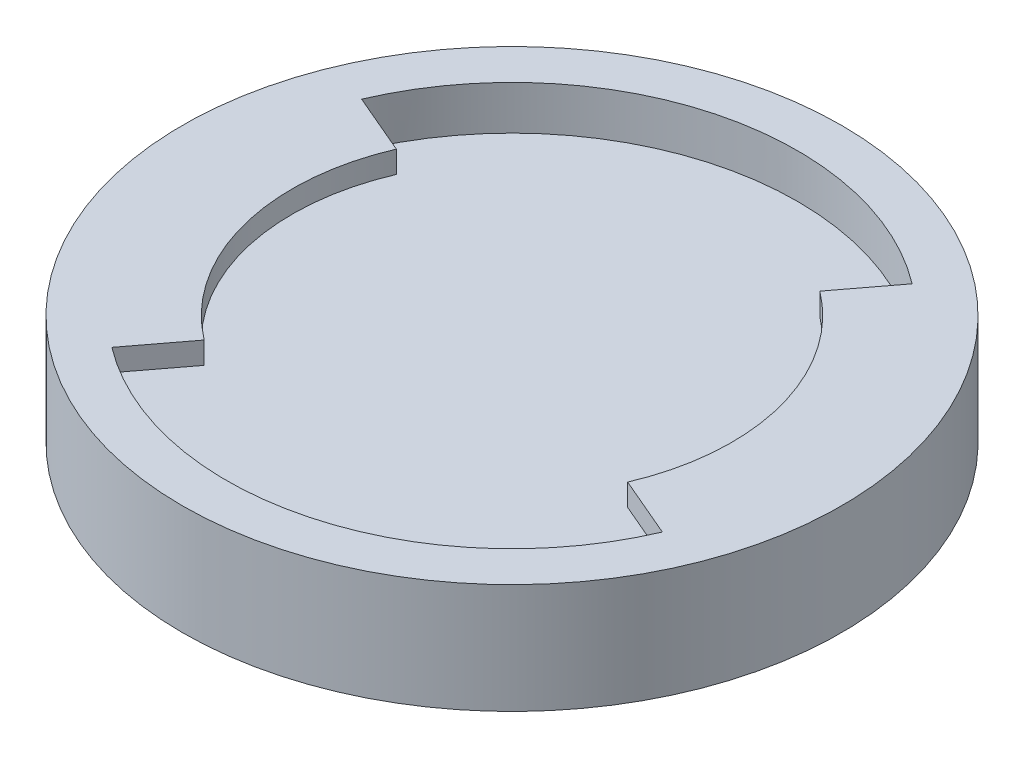
ISO-10303-21;
HEADER;
FILE_DESCRIPTION(('STEP AP214'),'2;1');
FILE_NAME('part.step','',(''),(''),'','','');
FILE_SCHEMA(('AUTOMOTIVE_DESIGN { 1 0 10303 214 1 1 1 1 }'));
ENDSEC;
DATA;
#1=APPLICATION_CONTEXT('core data for automotive mechanical design processes');
#2=APPLICATION_PROTOCOL_DEFINITION('international standard','automotive_design',2000,#1);
#3=PRODUCT_CONTEXT('',#1,'mechanical');
#4=PRODUCT('Part','Part','',(#3));
#5=PRODUCT_RELATED_PRODUCT_CATEGORY('part','',(#4));
#6=PRODUCT_DEFINITION_FORMATION('','',#4);
#7=PRODUCT_DEFINITION_CONTEXT('part definition',#1,'design');
#8=PRODUCT_DEFINITION('design','',#6,#7);
#9=PRODUCT_DEFINITION_SHAPE('','',#8);
#10=(LENGTH_UNIT() NAMED_UNIT(*) SI_UNIT(.MILLI.,.METRE.));
#11=(NAMED_UNIT(*) PLANE_ANGLE_UNIT() SI_UNIT($,.RADIAN.));
#12=(NAMED_UNIT(*) SI_UNIT($,.STERADIAN.) SOLID_ANGLE_UNIT());
#13=UNCERTAINTY_MEASURE_WITH_UNIT(LENGTH_MEASURE(1.E-05),#10,'distance_accuracy_value','');
#14=(GEOMETRIC_REPRESENTATION_CONTEXT(3) GLOBAL_UNCERTAINTY_ASSIGNED_CONTEXT((#13)) GLOBAL_UNIT_ASSIGNED_CONTEXT((#10,
#11,#12)) REPRESENTATION_CONTEXT('',''));
#15=CARTESIAN_POINT('',(0.,0.,0.));
#16=DIRECTION('',(0.,0.,1.));
#17=DIRECTION('',(1.,0.,0.));
#18=AXIS2_PLACEMENT_3D('',#15,#16,#17);
#19=CARTESIAN_POINT('',(0.,-3.,0.));
#20=DIRECTION('',(0.,1.,0.));
#21=DIRECTION('',(0.,0.,1.));
#22=AXIS2_PLACEMENT_3D('',#19,#20,#21);
#23=CYLINDRICAL_SURFACE('',#22,15.);
#24=CARTESIAN_POINT('',(0.,-3.,0.));
#25=DIRECTION('',(0.,1.,0.));
#26=DIRECTION('',(0.,0.,1.));
#27=AXIS2_PLACEMENT_3D('',#24,#25,#26);
#28=CIRCLE('',#27,15.);
#29=CARTESIAN_POINT('',(0.,-3.,15.));
#30=VERTEX_POINT('',#29);
#31=EDGE_CURVE('E40',#30,#30,#28,.T.);
#32=ORIENTED_EDGE('',*,*,#31,.T.);
#33=EDGE_LOOP('',(#32));
#34=FACE_BOUND('',#33,.T.);
#35=CARTESIAN_POINT('',(0.,2.,0.));
#36=DIRECTION('',(0.,1.,0.));
#37=DIRECTION('',(0.,0.,1.));
#38=AXIS2_PLACEMENT_3D('',#35,#36,#37);
#39=CIRCLE('',#38,15.);
#40=CARTESIAN_POINT('',(0.,2.,15.));
#41=VERTEX_POINT('',#40);
#42=EDGE_CURVE('E164',#41,#41,#39,.T.);
#43=ORIENTED_EDGE('',*,*,#42,.F.);
#44=EDGE_LOOP('',(#43));
#45=FACE_BOUND('',#44,.T.);
#46=ADVANCED_FACE('F33',(#34,#45),#23,.T.);
#47=CARTESIAN_POINT('',(0.,-3.,0.));
#48=DIRECTION('',(0.,1.,0.));
#49=DIRECTION('',(0.,0.,1.));
#50=AXIS2_PLACEMENT_3D('',#47,#48,#49);
#51=PLANE('',#50);
#52=ORIENTED_EDGE('',*,*,#31,.F.);
#53=EDGE_LOOP('',(#52));
#54=FACE_BOUND('',#53,.T.);
#55=ADVANCED_FACE('F171',(#54),#51,.F.);
#56=CARTESIAN_POINT('',(0.,2.,0.));
#57=DIRECTION('',(0.,1.,0.));
#58=DIRECTION('',(0.,0.,1.));
#59=AXIS2_PLACEMENT_3D('',#56,#57,#58);
#60=PLANE('',#59);
#61=ORIENTED_EDGE('',*,*,#42,.T.);
#62=EDGE_LOOP('',(#61));
#63=FACE_BOUND('',#62,.T.);
#64=CARTESIAN_POINT('',(0.,2.,0.));
#65=DIRECTION('',(0.,1.,0.));
#66=DIRECTION('',(0.,0.,1.));
#67=AXIS2_PLACEMENT_3D('',#64,#65,#66);
#68=CIRCLE('',#67,13.);
#69=CARTESIAN_POINT('',(7.85470191164406,2.,-10.3587478914787));
#70=VERTEX_POINT('',#69);
#71=CARTESIAN_POINT('',(-11.9536705087102,2.,-5.10977116602993));
#72=VERTEX_POINT('',#71);
#73=EDGE_CURVE('E162',#70,#72,#68,.T.);
#74=ORIENTED_EDGE('',*,*,#73,.F.);
#75=DIRECTION('',(-0.604207839357236,0.,0.796826760882979));
#76=VECTOR('',#75,1.);
#77=CARTESIAN_POINT('',(6.04207839357236,2.,-7.9682676088298));
#78=LINE('',#77,#76);
#79=CARTESIAN_POINT('',(6.04207839357236,2.,-7.9682676088298));
#80=VERTEX_POINT('',#79);
#81=EDGE_CURVE('E129',#70,#80,#78,.T.);
#82=ORIENTED_EDGE('',*,*,#81,.T.);
#83=CARTESIAN_POINT('',(0.,2.,0.));
#84=DIRECTION('',(0.,-1.,0.));
#85=DIRECTION('',(0.,0.,-1.));
#86=AXIS2_PLACEMENT_3D('',#83,#84,#85);
#87=CIRCLE('',#86,10.);
#88=CARTESIAN_POINT('',(9.19513116054635,2.,3.93059320463841));
#89=VERTEX_POINT('',#88);
#90=EDGE_CURVE('E147',#80,#89,#87,.T.);
#91=ORIENTED_EDGE('',*,*,#90,.T.);
#92=DIRECTION('',(0.919513116054634,0.,0.393059320463841));
#93=VECTOR('',#92,1.);
#94=CARTESIAN_POINT('',(9.19513116054635,2.,3.93059320463841));
#95=LINE('',#94,#93);
#96=CARTESIAN_POINT('',(11.9536705087102,2.,5.10977116602993));
#97=VERTEX_POINT('',#96);
#98=EDGE_CURVE('E135',#89,#97,#95,.T.);
#99=ORIENTED_EDGE('',*,*,#98,.T.);
#100=CARTESIAN_POINT('',(-7.85470191164406,2.,10.3587478914787));
#101=VERTEX_POINT('',#100);
#102=EDGE_CURVE('E155',#101,#97,#68,.T.);
#103=ORIENTED_EDGE('',*,*,#102,.F.);
#104=DIRECTION('',(0.604207839357236,0.,-0.796826760882979));
#105=VECTOR('',#104,1.);
#106=CARTESIAN_POINT('',(-6.04207839357236,2.,7.9682676088298));
#107=LINE('',#106,#105);
#108=CARTESIAN_POINT('',(-6.04207839357236,2.,7.96826760882979));
#109=VERTEX_POINT('',#108);
#110=EDGE_CURVE('E123',#101,#109,#107,.T.);
#111=ORIENTED_EDGE('',*,*,#110,.T.);
#112=CARTESIAN_POINT('',(0.,2.,0.));
#113=DIRECTION('',(0.,-1.,0.));
#114=DIRECTION('',(0.,0.,1.));
#115=AXIS2_PLACEMENT_3D('',#112,#113,#114);
#116=CIRCLE('',#115,10.);
#117=CARTESIAN_POINT('',(-9.19513116054635,2.,-3.93059320463841));
#118=VERTEX_POINT('',#117);
#119=EDGE_CURVE('E102',#109,#118,#116,.T.);
#120=ORIENTED_EDGE('',*,*,#119,.T.);
#121=DIRECTION('',(-0.919513116054634,0.,-0.393059320463841));
#122=VECTOR('',#121,1.);
#123=CARTESIAN_POINT('',(-9.19513116054635,2.,-3.93059320463841));
#124=LINE('',#123,#122);
#125=EDGE_CURVE('E119',#118,#72,#124,.T.);
#126=ORIENTED_EDGE('',*,*,#125,.T.);
#127=EDGE_LOOP('',(#74,#82,#91,#99,#103,#111,#120,#126));
#128=FACE_BOUND('',#127,.T.);
#129=ADVANCED_FACE('F173',(#63,#128),#60,.T.);
#130=CARTESIAN_POINT('',(0.,2.,0.));
#131=DIRECTION('',(0.,-1.,0.));
#132=DIRECTION('',(0.,0.,-1.));
#133=AXIS2_PLACEMENT_3D('',#130,#131,#132);
#134=CYLINDRICAL_SURFACE('',#133,13.);
#135=DIRECTION('',(0.,1.,0.));
#136=VECTOR('',#135,1.);
#137=CARTESIAN_POINT('',(-11.9536705087102,1.,-5.10977116602993));
#138=LINE('',#137,#136);
#139=CARTESIAN_POINT('',(-11.9536705087102,1.,-5.10977116602993));
#140=VERTEX_POINT('',#139);
#141=EDGE_CURVE('E52',#140,#72,#138,.T.);
#142=ORIENTED_EDGE('',*,*,#141,.F.);
#143=CARTESIAN_POINT('',(0.,1.,0.));
#144=DIRECTION('',(0.,1.,0.));
#145=DIRECTION('',(0.,0.,1.));
#146=AXIS2_PLACEMENT_3D('',#143,#144,#145);
#147=CIRCLE('',#146,13.);
#148=CARTESIAN_POINT('',(-7.85470191164406,1.,10.3587478914787));
#149=VERTEX_POINT('',#148);
#150=EDGE_CURVE('E47',#140,#149,#147,.T.);
#151=ORIENTED_EDGE('',*,*,#150,.T.);
#152=DIRECTION('',(0.,1.,0.));
#153=VECTOR('',#152,1.);
#154=CARTESIAN_POINT('',(-7.85470191164406,1.,10.3587478914787));
#155=LINE('',#154,#153);
#156=EDGE_CURVE('E108',#149,#101,#155,.T.);
#157=ORIENTED_EDGE('',*,*,#156,.T.);
#158=ORIENTED_EDGE('',*,*,#102,.T.);
#159=DIRECTION('',(0.,1.,0.));
#160=VECTOR('',#159,1.);
#161=CARTESIAN_POINT('',(11.9536705087102,1.,5.10977116602993));
#162=LINE('',#161,#160);
#163=CARTESIAN_POINT('',(11.9536705087102,1.,5.10977116602993));
#164=VERTEX_POINT('',#163);
#165=EDGE_CURVE('E152',#164,#97,#162,.T.);
#166=ORIENTED_EDGE('',*,*,#165,.F.);
#167=CARTESIAN_POINT('',(0.,1.,0.));
#168=DIRECTION('',(0.,1.,0.));
#169=DIRECTION('',(0.,0.,-1.));
#170=AXIS2_PLACEMENT_3D('',#167,#168,#169);
#171=CIRCLE('',#170,13.);
#172=CARTESIAN_POINT('',(7.85470191164406,1.,-10.3587478914787));
#173=VERTEX_POINT('',#172);
#174=EDGE_CURVE('E132',#164,#173,#171,.T.);
#175=ORIENTED_EDGE('',*,*,#174,.T.);
#176=DIRECTION('',(0.,1.,0.));
#177=VECTOR('',#176,1.);
#178=CARTESIAN_POINT('',(7.85470191164406,1.,-10.3587478914787));
#179=LINE('',#178,#177);
#180=EDGE_CURVE('E144',#173,#70,#179,.T.);
#181=ORIENTED_EDGE('',*,*,#180,.T.);
#182=ORIENTED_EDGE('',*,*,#73,.T.);
#183=EDGE_LOOP('',(#142,#151,#157,#158,#166,#175,#181,#182));
#184=FACE_BOUND('',#183,.T.);
#185=CARTESIAN_POINT('',(0.,0.,0.));
#186=DIRECTION('',(0.,1.,0.));
#187=DIRECTION('',(0.,0.,1.));
#188=AXIS2_PLACEMENT_3D('',#185,#186,#187);
#189=CIRCLE('',#188,13.);
#190=CARTESIAN_POINT('',(0.,0.,13.));
#191=VERTEX_POINT('',#190);
#192=EDGE_CURVE('E11',#191,#191,#189,.F.);
#193=ORIENTED_EDGE('',*,*,#192,.T.);
#194=EDGE_LOOP('',(#193));
#195=FACE_BOUND('',#194,.T.);
#196=ADVANCED_FACE('F179',(#184,#195),#134,.F.);
#197=CARTESIAN_POINT('',(0.,0.,0.));
#198=DIRECTION('',(0.,1.,0.));
#199=DIRECTION('',(0.,0.,1.));
#200=AXIS2_PLACEMENT_3D('',#197,#198,#199);
#201=PLANE('',#200);
#202=ORIENTED_EDGE('',*,*,#192,.F.);
#203=EDGE_LOOP('',(#202));
#204=FACE_BOUND('',#203,.T.);
#205=ADVANCED_FACE('F183',(#204),#201,.T.);
#206=CARTESIAN_POINT('',(9.19513116054635,1.,3.93059320463841));
#207=DIRECTION('',(-0.393059320463841,0.,0.919513116054634));
#208=DIRECTION('',(0.919513116054634,0.,0.393059320463841));
#209=AXIS2_PLACEMENT_3D('',#206,#207,#208);
#210=PLANE('',#209);
#211=ORIENTED_EDGE('',*,*,#98,.F.);
#212=DIRECTION('',(0.,1.,0.));
#213=VECTOR('',#212,1.);
#214=CARTESIAN_POINT('',(9.19513116054635,1.,3.93059320463841));
#215=LINE('',#214,#213);
#216=CARTESIAN_POINT('',(9.19513116054635,1.,3.93059320463841));
#217=VERTEX_POINT('',#216);
#218=EDGE_CURVE('E156',#217,#89,#215,.T.);
#219=ORIENTED_EDGE('',*,*,#218,.F.);
#220=DIRECTION('',(0.919513116054634,0.,0.393059320463841));
#221=VECTOR('',#220,1.);
#222=CARTESIAN_POINT('',(9.19513116054635,1.,3.93059320463841));
#223=LINE('',#222,#221);
#224=EDGE_CURVE('E141',#217,#164,#223,.T.);
#225=ORIENTED_EDGE('',*,*,#224,.T.);
#226=ORIENTED_EDGE('',*,*,#165,.T.);
#227=EDGE_LOOP('',(#211,#219,#225,#226));
#228=FACE_BOUND('',#227,.T.);
#229=ADVANCED_FACE('F185',(#228),#210,.T.);
#230=CARTESIAN_POINT('',(0.,1.,0.));
#231=DIRECTION('',(0.,1.,0.));
#232=DIRECTION('',(0.,0.,1.));
#233=AXIS2_PLACEMENT_3D('',#230,#231,#232);
#234=CYLINDRICAL_SURFACE('',#233,10.);
#235=ORIENTED_EDGE('',*,*,#90,.F.);
#236=DIRECTION('',(0.,1.,0.));
#237=VECTOR('',#236,1.);
#238=CARTESIAN_POINT('',(6.04207839357236,1.,-7.9682676088298));
#239=LINE('',#238,#237);
#240=CARTESIAN_POINT('',(6.04207839357236,1.,-7.9682676088298));
#241=VERTEX_POINT('',#240);
#242=EDGE_CURVE('E158',#241,#80,#239,.T.);
#243=ORIENTED_EDGE('',*,*,#242,.F.);
#244=CARTESIAN_POINT('',(0.,1.,0.));
#245=DIRECTION('',(0.,-1.,0.));
#246=DIRECTION('',(0.,0.,-1.));
#247=AXIS2_PLACEMENT_3D('',#244,#245,#246);
#248=CIRCLE('',#247,10.);
#249=EDGE_CURVE('E138',#241,#217,#248,.T.);
#250=ORIENTED_EDGE('',*,*,#249,.T.);
#251=ORIENTED_EDGE('',*,*,#218,.T.);
#252=EDGE_LOOP('',(#235,#243,#250,#251));
#253=FACE_BOUND('',#252,.T.);
#254=ADVANCED_FACE('F191',(#253),#234,.F.);
#255=CARTESIAN_POINT('',(6.04207839357236,1.,-7.9682676088298));
#256=DIRECTION('',(-0.796826760882979,0.,-0.604207839357236));
#257=DIRECTION('',(-0.604207839357236,0.,0.796826760882979));
#258=AXIS2_PLACEMENT_3D('',#255,#256,#257);
#259=PLANE('',#258);
#260=ORIENTED_EDGE('',*,*,#81,.F.);
#261=ORIENTED_EDGE('',*,*,#180,.F.);
#262=DIRECTION('',(-0.604207839357236,0.,0.796826760882979));
#263=VECTOR('',#262,1.);
#264=CARTESIAN_POINT('',(6.04207839357236,1.,-7.9682676088298));
#265=LINE('',#264,#263);
#266=EDGE_CURVE('E134',#173,#241,#265,.T.);
#267=ORIENTED_EDGE('',*,*,#266,.T.);
#268=ORIENTED_EDGE('',*,*,#242,.T.);
#269=EDGE_LOOP('',(#260,#261,#267,#268));
#270=FACE_BOUND('',#269,.T.);
#271=ADVANCED_FACE('F199',(#270),#259,.T.);
#272=CARTESIAN_POINT('',(0.,1.,0.));
#273=DIRECTION('',(0.,-1.,0.));
#274=DIRECTION('',(0.,0.,-1.));
#275=AXIS2_PLACEMENT_3D('',#272,#273,#274);
#276=PLANE('',#275);
#277=ORIENTED_EDGE('',*,*,#174,.F.);
#278=ORIENTED_EDGE('',*,*,#224,.F.);
#279=ORIENTED_EDGE('',*,*,#249,.F.);
#280=ORIENTED_EDGE('',*,*,#266,.F.);
#281=EDGE_LOOP('',(#277,#278,#279,#280));
#282=FACE_BOUND('',#281,.T.);
#283=ADVANCED_FACE('F202',(#282),#276,.T.);
#284=CARTESIAN_POINT('',(-9.19513116054635,1.,-3.93059320463841));
#285=DIRECTION('',(0.393059320463841,0.,-0.919513116054634));
#286=DIRECTION('',(-0.919513116054634,0.,-0.393059320463841));
#287=AXIS2_PLACEMENT_3D('',#284,#285,#286);
#288=PLANE('',#287);
#289=ORIENTED_EDGE('',*,*,#125,.F.);
#290=DIRECTION('',(0.,1.,0.));
#291=VECTOR('',#290,1.);
#292=CARTESIAN_POINT('',(-9.19513116054635,1.,-3.93059320463841));
#293=LINE('',#292,#291);
#294=CARTESIAN_POINT('',(-9.19513116054635,1.,-3.93059320463841));
#295=VERTEX_POINT('',#294);
#296=EDGE_CURVE('E107',#295,#118,#293,.T.);
#297=ORIENTED_EDGE('',*,*,#296,.F.);
#298=DIRECTION('',(-0.919513116054634,0.,-0.393059320463841));
#299=VECTOR('',#298,1.);
#300=CARTESIAN_POINT('',(-9.19513116054635,1.,-3.93059320463841));
#301=LINE('',#300,#299);
#302=EDGE_CURVE('E115',#295,#140,#301,.T.);
#303=ORIENTED_EDGE('',*,*,#302,.T.);
#304=ORIENTED_EDGE('',*,*,#141,.T.);
#305=EDGE_LOOP('',(#289,#297,#303,#304));
#306=FACE_BOUND('',#305,.T.);
#307=ADVANCED_FACE('F209',(#306),#288,.T.);
#308=CARTESIAN_POINT('',(0.,1.,0.));
#309=DIRECTION('',(0.,1.,0.));
#310=DIRECTION('',(0.,0.,1.));
#311=AXIS2_PLACEMENT_3D('',#308,#309,#310);
#312=CYLINDRICAL_SURFACE('',#311,10.);
#313=ORIENTED_EDGE('',*,*,#119,.F.);
#314=DIRECTION('',(0.,1.,0.));
#315=VECTOR('',#314,1.);
#316=CARTESIAN_POINT('',(-6.04207839357236,1.,7.96826760882979));
#317=LINE('',#316,#315);
#318=CARTESIAN_POINT('',(-6.04207839357236,1.,7.96826760882979));
#319=VERTEX_POINT('',#318);
#320=EDGE_CURVE('E96',#319,#109,#317,.T.);
#321=ORIENTED_EDGE('',*,*,#320,.F.);
#322=CARTESIAN_POINT('',(0.,1.,0.));
#323=DIRECTION('',(0.,-1.,0.));
#324=DIRECTION('',(0.,0.,1.));
#325=AXIS2_PLACEMENT_3D('',#322,#323,#324);
#326=CIRCLE('',#325,10.);
#327=EDGE_CURVE('E99',#319,#295,#326,.T.);
#328=ORIENTED_EDGE('',*,*,#327,.T.);
#329=ORIENTED_EDGE('',*,*,#296,.T.);
#330=EDGE_LOOP('',(#313,#321,#328,#329));
#331=FACE_BOUND('',#330,.T.);
#332=ADVANCED_FACE('F98',(#331),#312,.F.);
#333=CARTESIAN_POINT('',(-6.04207839357236,1.,7.9682676088298));
#334=DIRECTION('',(0.796826760882979,0.,0.604207839357236));
#335=DIRECTION('',(0.604207839357236,0.,-0.796826760882979));
#336=AXIS2_PLACEMENT_3D('',#333,#334,#335);
#337=PLANE('',#336);
#338=ORIENTED_EDGE('',*,*,#110,.F.);
#339=ORIENTED_EDGE('',*,*,#156,.F.);
#340=DIRECTION('',(0.604207839357236,0.,-0.796826760882979));
#341=VECTOR('',#340,1.);
#342=CARTESIAN_POINT('',(-6.04207839357236,1.,7.9682676088298));
#343=LINE('',#342,#341);
#344=EDGE_CURVE('E113',#149,#319,#343,.T.);
#345=ORIENTED_EDGE('',*,*,#344,.T.);
#346=ORIENTED_EDGE('',*,*,#320,.T.);
#347=EDGE_LOOP('',(#338,#339,#345,#346));
#348=FACE_BOUND('',#347,.T.);
#349=ADVANCED_FACE('F117',(#348),#337,.T.);
#350=CARTESIAN_POINT('',(0.,1.,0.));
#351=DIRECTION('',(0.,1.,0.));
#352=DIRECTION('',(0.,0.,1.));
#353=AXIS2_PLACEMENT_3D('',#350,#351,#352);
#354=PLANE('',#353);
#355=ORIENTED_EDGE('',*,*,#150,.F.);
#356=ORIENTED_EDGE('',*,*,#302,.F.);
#357=ORIENTED_EDGE('',*,*,#327,.F.);
#358=ORIENTED_EDGE('',*,*,#344,.F.);
#359=EDGE_LOOP('',(#355,#356,#357,#358));
#360=FACE_BOUND('',#359,.T.);
#361=ADVANCED_FACE('F112',(#360),#354,.F.);
#362=CLOSED_SHELL('',(#46,#55,#129,#196,#205,#229,#254,#271,#283,#307,#332,#349,#361));
#363=MANIFOLD_SOLID_BREP('B2',#362);
#364=ADVANCED_BREP_SHAPE_REPRESENTATION('',(#18,#363),#14);
#365=SHAPE_DEFINITION_REPRESENTATION(#9,#364);
ENDSEC;
END-ISO-10303-21;
